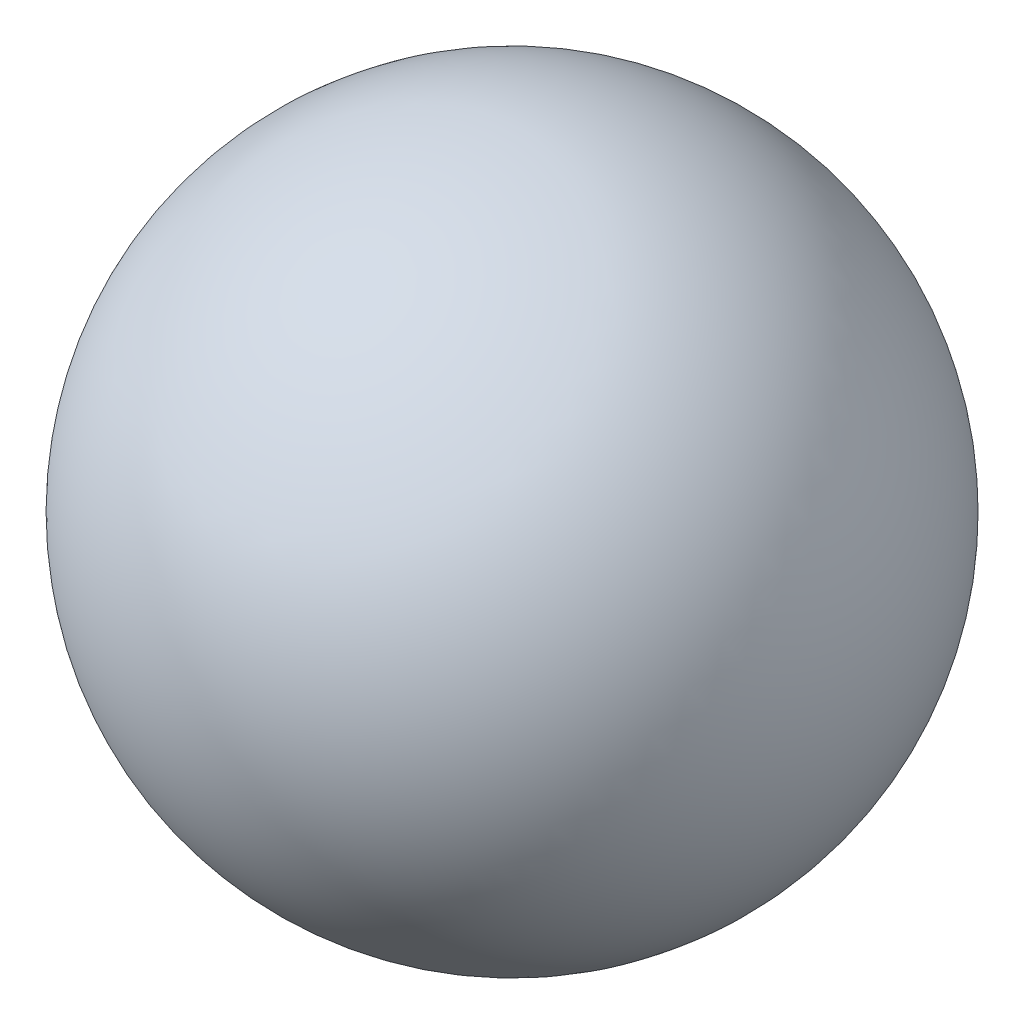
ISO-10303-21;
HEADER;
FILE_DESCRIPTION(('STEP AP214'),'2;1');
FILE_NAME('part.step','',(''),(''),'','','');
FILE_SCHEMA(('AUTOMOTIVE_DESIGN { 1 0 10303 214 1 1 1 1 }'));
ENDSEC;
DATA;
#1=APPLICATION_CONTEXT('core data for automotive mechanical design processes');
#2=APPLICATION_PROTOCOL_DEFINITION('international standard','automotive_design',2000,#1);
#3=PRODUCT_CONTEXT('',#1,'mechanical');
#4=PRODUCT('Part','Part','',(#3));
#5=PRODUCT_RELATED_PRODUCT_CATEGORY('part','',(#4));
#6=PRODUCT_DEFINITION_FORMATION('','',#4);
#7=PRODUCT_DEFINITION_CONTEXT('part definition',#1,'design');
#8=PRODUCT_DEFINITION('design','',#6,#7);
#9=PRODUCT_DEFINITION_SHAPE('','',#8);
#10=(LENGTH_UNIT() NAMED_UNIT(*) SI_UNIT(.MILLI.,.METRE.));
#11=(NAMED_UNIT(*) PLANE_ANGLE_UNIT() SI_UNIT($,.RADIAN.));
#12=(NAMED_UNIT(*) SI_UNIT($,.STERADIAN.) SOLID_ANGLE_UNIT());
#13=UNCERTAINTY_MEASURE_WITH_UNIT(LENGTH_MEASURE(1.E-05),#10,'distance_accuracy_value','');
#14=(GEOMETRIC_REPRESENTATION_CONTEXT(3) GLOBAL_UNCERTAINTY_ASSIGNED_CONTEXT((#13)) GLOBAL_UNIT_ASSIGNED_CONTEXT((#10,
#11,#12)) REPRESENTATION_CONTEXT('',''));
#15=CARTESIAN_POINT('',(0.,0.,0.));
#16=DIRECTION('',(0.,0.,1.));
#17=DIRECTION('',(1.,0.,0.));
#18=AXIS2_PLACEMENT_3D('',#15,#16,#17);
#19=CARTESIAN_POINT('',(-335.443342604409,59.2132480595915,0.));
#20=DIRECTION('',(0.454971346118987,-0.890506077582111,0.));
#21=DIRECTION('',(-0.890506077582111,-0.454971346118987,0.));
#22=AXIS2_PLACEMENT_3D('',#19,#20,#21);
#23=SPHERICAL_SURFACE('',#22,3.49999999999999);
#24=CARTESIAN_POINT('',(-333.850942892992,56.0964767880541,0.));
#25=VERTEX_POINT('',#24);
#26=VERTEX_LOOP('',#25);
#27=FACE_BOUND('',#26,.T.);
#28=ADVANCED_FACE('F30',(#27),#23,.T.);
#29=CLOSED_SHELL('',(#28));
#30=MANIFOLD_SOLID_BREP('B2',#29);
#31=ADVANCED_BREP_SHAPE_REPRESENTATION('',(#18,#30),#14);
#32=SHAPE_DEFINITION_REPRESENTATION(#9,#31);
ENDSEC;
END-ISO-10303-21;
